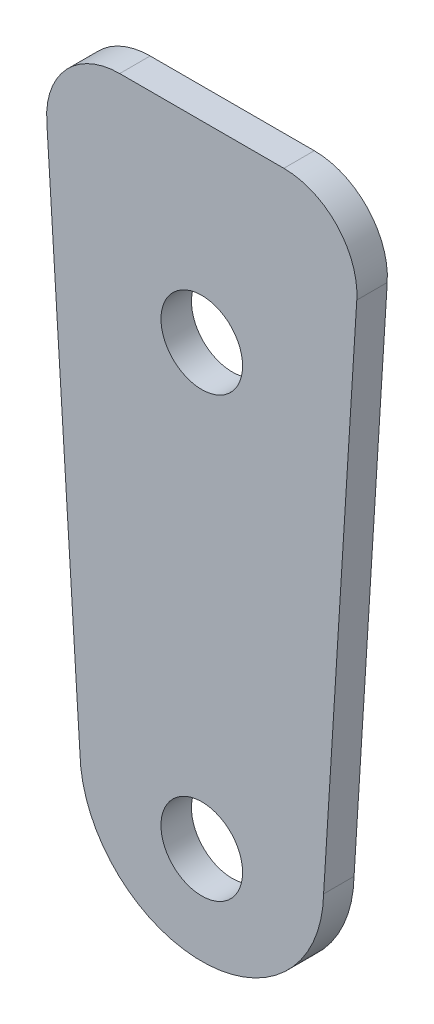
ISO-10303-21;
HEADER;
FILE_DESCRIPTION(('STEP AP214'),'2;1');
FILE_NAME('part.step','',(''),(''),'','','');
FILE_SCHEMA(('AUTOMOTIVE_DESIGN { 1 0 10303 214 1 1 1 1 }'));
ENDSEC;
DATA;
#1=APPLICATION_CONTEXT('core data for automotive mechanical design processes');
#2=APPLICATION_PROTOCOL_DEFINITION('international standard','automotive_design',2000,#1);
#3=PRODUCT_CONTEXT('',#1,'mechanical');
#4=PRODUCT('Part','Part','',(#3));
#5=PRODUCT_RELATED_PRODUCT_CATEGORY('part','',(#4));
#6=PRODUCT_DEFINITION_FORMATION('','',#4);
#7=PRODUCT_DEFINITION_CONTEXT('part definition',#1,'design');
#8=PRODUCT_DEFINITION('design','',#6,#7);
#9=PRODUCT_DEFINITION_SHAPE('','',#8);
#10=(LENGTH_UNIT() NAMED_UNIT(*) SI_UNIT(.MILLI.,.METRE.));
#11=(NAMED_UNIT(*) PLANE_ANGLE_UNIT() SI_UNIT($,.RADIAN.));
#12=(NAMED_UNIT(*) SI_UNIT($,.STERADIAN.) SOLID_ANGLE_UNIT());
#13=UNCERTAINTY_MEASURE_WITH_UNIT(LENGTH_MEASURE(1.E-05),#10,'distance_accuracy_value','');
#14=(GEOMETRIC_REPRESENTATION_CONTEXT(3) GLOBAL_UNCERTAINTY_ASSIGNED_CONTEXT((#13)) GLOBAL_UNIT_ASSIGNED_CONTEXT((#10,
#11,#12)) REPRESENTATION_CONTEXT('',''));
#15=CARTESIAN_POINT('',(0.,0.,0.));
#16=DIRECTION('',(0.,0.,1.));
#17=DIRECTION('',(1.,0.,0.));
#18=AXIS2_PLACEMENT_3D('',#15,#16,#17);
#19=CARTESIAN_POINT('',(0.0147414642697603,-105.114260788739,-76.2));
#20=DIRECTION('',(0.,0.,1.));
#21=DIRECTION('',(1.,0.,0.));
#22=AXIS2_PLACEMENT_3D('',#19,#20,#21);
#23=CYLINDRICAL_SURFACE('',#22,6.35136235795166);
#24=DIRECTION('',(0.,0.,1.));
#25=VECTOR('',#24,1.);
#26=CARTESIAN_POINT('',(-6.33525853573024,-105.24580470538,-76.2));
#27=LINE('',#26,#25);
#28=CARTESIAN_POINT('',(-6.33525853573024,-105.24580470538,58.6104999999999));
#29=VERTEX_POINT('',#28);
#30=CARTESIAN_POINT('',(-6.33525853573024,-105.24580470538,60.1979999999999));
#31=VERTEX_POINT('',#30);
#32=EDGE_CURVE('E118',#29,#31,#27,.T.);
#33=ORIENTED_EDGE('',*,*,#32,.F.);
#34=CARTESIAN_POINT('',(0.0147414642697603,-105.114260788739,58.6104999999999));
#35=DIRECTION('',(0.,0.,1.));
#36=DIRECTION('',(1.,0.,0.));
#37=AXIS2_PLACEMENT_3D('',#34,#35,#36);
#38=CIRCLE('',#37,6.35136235795166);
#39=CARTESIAN_POINT('',(6.36474146426976,-105.24580470538,58.6104999999999));
#40=VERTEX_POINT('',#39);
#41=EDGE_CURVE('E148',#40,#29,#38,.F.);
#42=ORIENTED_EDGE('',*,*,#41,.F.);
#43=DIRECTION('',(0.,0.,1.));
#44=VECTOR('',#43,1.);
#45=CARTESIAN_POINT('',(6.36474146426976,-105.24580470538,-76.2));
#46=LINE('',#45,#44);
#47=CARTESIAN_POINT('',(6.36474146426976,-105.24580470538,60.1979999999999));
#48=VERTEX_POINT('',#47);
#49=EDGE_CURVE('E136',#40,#48,#46,.T.);
#50=ORIENTED_EDGE('',*,*,#49,.T.);
#51=CARTESIAN_POINT('',(0.0147414642697603,-105.114260788739,60.1979999999999));
#52=DIRECTION('',(0.,0.,-1.));
#53=DIRECTION('',(-1.,0.,0.));
#54=AXIS2_PLACEMENT_3D('',#51,#52,#53);
#55=CIRCLE('',#54,6.35136235795166);
#56=EDGE_CURVE('E137',#31,#48,#55,.F.);
#57=ORIENTED_EDGE('',*,*,#56,.F.);
#58=EDGE_LOOP('',(#33,#42,#50,#57));
#59=FACE_BOUND('',#58,.T.);
#60=ADVANCED_FACE('F40',(#59),#23,.T.);
#61=CARTESIAN_POINT('',(-6.33525853573024,-105.24580470538,-76.2));
#62=DIRECTION('',(-0.998052578482889,-0.0623782861551806,0.));
#63=DIRECTION('',(0.0623782861551806,-0.998052578482889,0.));
#64=AXIS2_PLACEMENT_3D('',#61,#62,#63);
#65=PLANE('',#64);
#66=DIRECTION('',(-0.0623782861551806,0.998052578482889,0.));
#67=VECTOR('',#66,1.);
#68=CARTESIAN_POINT('',(-6.33525853573024,-105.24580470538,58.6104999999999));
#69=LINE('',#68,#67);
#70=CARTESIAN_POINT('',(-8.06485468746499,-77.5722662776241,58.6104999999999));
#71=VERTEX_POINT('',#70);
#72=EDGE_CURVE('E55',#29,#71,#69,.T.);
#73=ORIENTED_EDGE('',*,*,#72,.F.);
#74=ORIENTED_EDGE('',*,*,#32,.T.);
#75=DIRECTION('',(0.0623782861551806,-0.998052578482889,0.));
#76=VECTOR('',#75,1.);
#77=CARTESIAN_POINT('',(-6.33525853573024,-105.24580470538,60.1979999999999));
#78=LINE('',#77,#76);
#79=CARTESIAN_POINT('',(-8.06485468746499,-77.5722662776241,60.1979999999999));
#80=VERTEX_POINT('',#79);
#81=EDGE_CURVE('E132',#80,#31,#78,.T.);
#82=ORIENTED_EDGE('',*,*,#81,.F.);
#83=DIRECTION('',(0.,0.,1.));
#84=VECTOR('',#83,1.);
#85=CARTESIAN_POINT('',(-8.06485468746499,-77.5722662776241,47.4979999999999));
#86=LINE('',#85,#84);
#87=EDGE_CURVE('E49',#80,#71,#86,.F.);
#88=ORIENTED_EDGE('',*,*,#87,.T.);
#89=EDGE_LOOP('',(#73,#74,#82,#88));
#90=FACE_BOUND('',#89,.T.);
#91=ADVANCED_FACE('F130',(#90),#65,.T.);
#92=CARTESIAN_POINT('',(6.36474146426976,-105.24580470538,-76.2));
#93=DIRECTION('',(0.998052578482889,-0.0623782861551805,0.));
#94=DIRECTION('',(0.0623782861551805,0.998052578482889,0.));
#95=AXIS2_PLACEMENT_3D('',#92,#93,#94);
#96=PLANE('',#95);
#97=DIRECTION('',(-0.0623782861551805,-0.998052578482889,0.));
#98=VECTOR('',#97,1.);
#99=CARTESIAN_POINT('',(6.36474146426976,-105.24580470538,58.6104999999999));
#100=LINE('',#99,#98);
#101=CARTESIAN_POINT('',(8.0943376160045,-77.5722662776241,58.6104999999999));
#102=VERTEX_POINT('',#101);
#103=EDGE_CURVE('E149',#102,#40,#100,.T.);
#104=ORIENTED_EDGE('',*,*,#103,.F.);
#105=DIRECTION('',(0.,0.,-1.));
#106=VECTOR('',#105,1.);
#107=CARTESIAN_POINT('',(8.0943376160045,-77.5722662776241,60.1979999999999));
#108=LINE('',#107,#106);
#109=CARTESIAN_POINT('',(8.0943376160045,-77.5722662776241,60.1979999999999));
#110=VERTEX_POINT('',#109);
#111=EDGE_CURVE('E115',#102,#110,#108,.F.);
#112=ORIENTED_EDGE('',*,*,#111,.T.);
#113=DIRECTION('',(0.0623782861551805,0.998052578482889,0.));
#114=VECTOR('',#113,1.);
#115=CARTESIAN_POINT('',(6.36474146426976,-105.24580470538,60.1979999999999));
#116=LINE('',#115,#114);
#117=EDGE_CURVE('E111',#48,#110,#116,.T.);
#118=ORIENTED_EDGE('',*,*,#117,.F.);
#119=ORIENTED_EDGE('',*,*,#49,.F.);
#120=EDGE_LOOP('',(#104,#112,#118,#119));
#121=FACE_BOUND('',#120,.T.);
#122=ADVANCED_FACE('F198',(#121),#96,.T.);
#123=CARTESIAN_POINT('',(-12.6852585357302,-73.5246050073729,47.4979999999999));
#124=DIRECTION('',(0.,-1.,0.));
#125=DIRECTION('',(0.,0.,-1.));
#126=AXIS2_PLACEMENT_3D('',#123,#124,#125);
#127=PLANE('',#126);
#128=DIRECTION('',(0.,0.,-1.));
#129=VECTOR('',#128,1.);
#130=CARTESIAN_POINT('',(4.2917572919847,-73.5246050073729,47.4979999999999));
#131=LINE('',#130,#129);
#132=CARTESIAN_POINT('',(4.2917572919847,-73.5246050073729,60.1979999999999));
#133=VERTEX_POINT('',#132);
#134=CARTESIAN_POINT('',(4.29175729198469,-73.5246050073729,58.6104999999999));
#135=VERTEX_POINT('',#134);
#136=EDGE_CURVE('E106',#133,#135,#131,.T.);
#137=ORIENTED_EDGE('',*,*,#136,.T.);
#138=DIRECTION('',(-1.,0.,0.));
#139=VECTOR('',#138,1.);
#140=CARTESIAN_POINT('',(-12.6852585357302,-73.5246050073729,58.6104999999999));
#141=LINE('',#140,#139);
#142=CARTESIAN_POINT('',(-4.26227436344518,-73.5246050073729,58.6104999999999));
#143=VERTEX_POINT('',#142);
#144=EDGE_CURVE('E94',#135,#143,#141,.T.);
#145=ORIENTED_EDGE('',*,*,#144,.T.);
#146=DIRECTION('',(0.,0.,1.));
#147=VECTOR('',#146,1.);
#148=CARTESIAN_POINT('',(-4.26227436344518,-73.5246050073729,60.1979999999999));
#149=LINE('',#148,#147);
#150=CARTESIAN_POINT('',(-4.26227436344518,-73.5246050073729,60.1979999999999));
#151=VERTEX_POINT('',#150);
#152=EDGE_CURVE('E104',#143,#151,#149,.T.);
#153=ORIENTED_EDGE('',*,*,#152,.T.);
#154=DIRECTION('',(1.,0.,0.));
#155=VECTOR('',#154,1.);
#156=CARTESIAN_POINT('',(-12.6852585357302,-73.5246050073729,60.1979999999999));
#157=LINE('',#156,#155);
#158=EDGE_CURVE('E141',#151,#133,#157,.T.);
#159=ORIENTED_EDGE('',*,*,#158,.T.);
#160=EDGE_LOOP('',(#137,#145,#153,#159));
#161=FACE_BOUND('',#160,.T.);
#162=ADVANCED_FACE('F102',(#161),#127,.F.);
#163=CARTESIAN_POINT('',(-12.6852585357302,-73.5246050073729,60.1979999999999));
#164=DIRECTION('',(0.,0.,-1.));
#165=DIRECTION('',(-1.,0.,0.));
#166=AXIS2_PLACEMENT_3D('',#163,#164,#165);
#167=PLANE('',#166);
#168=CARTESIAN_POINT('',(0.0147414642697566,-106.385623146691,60.1979999999999));
#169=DIRECTION('',(0.,0.,1.));
#170=DIRECTION('',(1.,0.,0.));
#171=AXIS2_PLACEMENT_3D('',#168,#169,#170);
#172=CIRCLE('',#171,2.127);
#173=CARTESIAN_POINT('',(2.14174146426976,-106.385623146691,60.1979999999999));
#174=VERTEX_POINT('',#173);
#175=EDGE_CURVE('E167',#174,#174,#172,.T.);
#176=ORIENTED_EDGE('',*,*,#175,.F.);
#177=EDGE_LOOP('',(#176));
#178=FACE_BOUND('',#177,.T.);
#179=CARTESIAN_POINT('',(0.0147414642697538,-83.5256231466905,60.1979999999999));
#180=DIRECTION('',(0.,0.,1.));
#181=DIRECTION('',(1.,0.,0.));
#182=AXIS2_PLACEMENT_3D('',#179,#180,#181);
#183=CIRCLE('',#182,2.127);
#184=CARTESIAN_POINT('',(2.14174146426975,-83.5256231466905,60.1979999999999));
#185=VERTEX_POINT('',#184);
#186=EDGE_CURVE('E159',#185,#185,#183,.T.);
#187=ORIENTED_EDGE('',*,*,#186,.F.);
#188=EDGE_LOOP('',(#187));
#189=FACE_BOUND('',#188,.T.);
#190=ORIENTED_EDGE('',*,*,#117,.T.);
#191=CARTESIAN_POINT('',(4.2917572919847,-77.3346050073729,60.1979999999999));
#192=DIRECTION('',(0.,0.,-1.));
#193=DIRECTION('',(-1.,0.,0.));
#194=AXIS2_PLACEMENT_3D('',#191,#192,#193);
#195=CIRCLE('',#194,3.81);
#196=EDGE_CURVE('E126',#110,#133,#195,.F.);
#197=ORIENTED_EDGE('',*,*,#196,.T.);
#198=ORIENTED_EDGE('',*,*,#158,.F.);
#199=CARTESIAN_POINT('',(-4.26227436344518,-77.3346050073729,60.1979999999999));
#200=DIRECTION('',(0.,0.,-1.));
#201=DIRECTION('',(-1.,0.,0.));
#202=AXIS2_PLACEMENT_3D('',#199,#200,#201);
#203=CIRCLE('',#202,3.81);
#204=EDGE_CURVE('E63',#151,#80,#203,.F.);
#205=ORIENTED_EDGE('',*,*,#204,.T.);
#206=ORIENTED_EDGE('',*,*,#81,.T.);
#207=ORIENTED_EDGE('',*,*,#56,.T.);
#208=EDGE_LOOP('',(#190,#197,#198,#205,#206,#207));
#209=FACE_BOUND('',#208,.T.);
#210=ADVANCED_FACE('F184',(#178,#189,#209),#167,.F.);
#211=CARTESIAN_POINT('',(4.2917572919847,-77.3346050073729,47.4979999999999));
#212=DIRECTION('',(0.,0.,1.));
#213=DIRECTION('',(0.,-1.,0.));
#214=AXIS2_PLACEMENT_3D('',#211,#212,#213);
#215=CYLINDRICAL_SURFACE('',#214,3.81);
#216=CARTESIAN_POINT('',(4.2917572919847,-77.3346050073729,58.6104999999999));
#217=DIRECTION('',(0.,0.,1.));
#218=DIRECTION('',(1.,0.,0.));
#219=AXIS2_PLACEMENT_3D('',#216,#217,#218);
#220=CIRCLE('',#219,3.81);
#221=EDGE_CURVE('E152',#135,#102,#220,.F.);
#222=ORIENTED_EDGE('',*,*,#221,.F.);
#223=ORIENTED_EDGE('',*,*,#136,.F.);
#224=ORIENTED_EDGE('',*,*,#196,.F.);
#225=ORIENTED_EDGE('',*,*,#111,.F.);
#226=EDGE_LOOP('',(#222,#223,#224,#225));
#227=FACE_BOUND('',#226,.T.);
#228=ADVANCED_FACE('F187',(#227),#215,.T.);
#229=CARTESIAN_POINT('',(-4.26227436344518,-77.3346050073729,47.4979999999999));
#230=DIRECTION('',(0.,0.,-1.));
#231=DIRECTION('',(0.,1.,0.));
#232=AXIS2_PLACEMENT_3D('',#229,#230,#231);
#233=CYLINDRICAL_SURFACE('',#232,3.81);
#234=CARTESIAN_POINT('',(-4.26227436344518,-77.3346050073729,58.6104999999999));
#235=DIRECTION('',(0.,0.,1.));
#236=DIRECTION('',(1.,0.,0.));
#237=AXIS2_PLACEMENT_3D('',#234,#235,#236);
#238=CIRCLE('',#237,3.81);
#239=EDGE_CURVE('E11',#71,#143,#238,.F.);
#240=ORIENTED_EDGE('',*,*,#239,.F.);
#241=ORIENTED_EDGE('',*,*,#87,.F.);
#242=ORIENTED_EDGE('',*,*,#204,.F.);
#243=ORIENTED_EDGE('',*,*,#152,.F.);
#244=EDGE_LOOP('',(#240,#241,#242,#243));
#245=FACE_BOUND('',#244,.T.);
#246=ADVANCED_FACE('F42',(#245),#233,.T.);
#247=CARTESIAN_POINT('',(-32.8306227687139,-111.465623146691,58.6104999999999));
#248=DIRECTION('',(0.,0.,1.));
#249=DIRECTION('',(1.,0.,0.));
#250=AXIS2_PLACEMENT_3D('',#247,#248,#249);
#251=PLANE('',#250);
#252=CARTESIAN_POINT('',(0.0147414642697566,-106.385623146691,58.6104999999999));
#253=DIRECTION('',(0.,0.,1.));
#254=DIRECTION('',(1.,0.,0.));
#255=AXIS2_PLACEMENT_3D('',#252,#253,#254);
#256=CIRCLE('',#255,2.127);
#257=CARTESIAN_POINT('',(2.14174146426976,-106.385623146691,58.6104999999999));
#258=VERTEX_POINT('',#257);
#259=EDGE_CURVE('E108',#258,#258,#256,.T.);
#260=ORIENTED_EDGE('',*,*,#259,.T.);
#261=EDGE_LOOP('',(#260));
#262=FACE_BOUND('',#261,.T.);
#263=CARTESIAN_POINT('',(0.0147414642697538,-83.5256231466905,58.6104999999999));
#264=DIRECTION('',(0.,0.,1.));
#265=DIRECTION('',(1.,0.,0.));
#266=AXIS2_PLACEMENT_3D('',#263,#264,#265);
#267=CIRCLE('',#266,2.127);
#268=CARTESIAN_POINT('',(2.14174146426975,-83.5256231466905,58.6104999999999));
#269=VERTEX_POINT('',#268);
#270=EDGE_CURVE('E163',#269,#269,#267,.T.);
#271=ORIENTED_EDGE('',*,*,#270,.T.);
#272=EDGE_LOOP('',(#271));
#273=FACE_BOUND('',#272,.T.);
#274=ORIENTED_EDGE('',*,*,#41,.T.);
#275=ORIENTED_EDGE('',*,*,#72,.T.);
#276=ORIENTED_EDGE('',*,*,#239,.T.);
#277=ORIENTED_EDGE('',*,*,#144,.F.);
#278=ORIENTED_EDGE('',*,*,#221,.T.);
#279=ORIENTED_EDGE('',*,*,#103,.T.);
#280=EDGE_LOOP('',(#274,#275,#276,#277,#278,#279));
#281=FACE_BOUND('',#280,.T.);
#282=ADVANCED_FACE('F93',(#262,#273,#281),#251,.F.);
#283=CARTESIAN_POINT('',(0.0147414642697538,-83.5256231466905,58.6104999999999));
#284=DIRECTION('',(0.,0.,1.));
#285=DIRECTION('',(1.,0.,0.));
#286=AXIS2_PLACEMENT_3D('',#283,#284,#285);
#287=CYLINDRICAL_SURFACE('',#286,2.127);
#288=CARTESIAN_POINT('',(2.14174146426975,-83.5256231466905,58.6104999999999));
#289=CARTESIAN_POINT('',(2.14174146426975,-83.5256231466905,58.6270364583332));
#290=CARTESIAN_POINT('',(2.14174146426975,-83.5256231466905,58.6435729166665));
#291=CARTESIAN_POINT('',(2.14174146426975,-83.5256231466905,58.6766458333332));
#292=CARTESIAN_POINT('',(2.14174146426975,-83.5256231466905,58.6931822916665));
#293=CARTESIAN_POINT('',(2.14174146426975,-83.5256231466905,58.7262552083332));
#294=CARTESIAN_POINT('',(2.14174146426975,-83.5256231466905,58.7427916666665));
#295=CARTESIAN_POINT('',(2.14174146426975,-83.5256231466905,58.7758645833332));
#296=CARTESIAN_POINT('',(2.14174146426975,-83.5256231466905,58.7924010416665));
#297=CARTESIAN_POINT('',(2.14174146426975,-83.5256231466905,58.8254739583332));
#298=CARTESIAN_POINT('',(2.14174146426975,-83.5256231466905,58.8420104166665));
#299=CARTESIAN_POINT('',(2.14174146426975,-83.5256231466905,58.8750833333332));
#300=CARTESIAN_POINT('',(2.14174146426975,-83.5256231466905,58.8916197916665));
#301=CARTESIAN_POINT('',(2.14174146426975,-83.5256231466905,58.9246927083332));
#302=CARTESIAN_POINT('',(2.14174146426975,-83.5256231466905,58.9412291666665));
#303=CARTESIAN_POINT('',(2.14174146426975,-83.5256231466905,58.9743020833332));
#304=CARTESIAN_POINT('',(2.14174146426975,-83.5256231466905,58.9908385416665));
#305=CARTESIAN_POINT('',(2.14174146426975,-83.5256231466905,59.0239114583332));
#306=CARTESIAN_POINT('',(2.14174146426975,-83.5256231466905,59.0404479166666));
#307=CARTESIAN_POINT('',(2.14174146426975,-83.5256231466905,59.0735208333332));
#308=CARTESIAN_POINT('',(2.14174146426975,-83.5256231466905,59.0900572916665));
#309=CARTESIAN_POINT('',(2.14174146426975,-83.5256231466905,59.1231302083332));
#310=CARTESIAN_POINT('',(2.14174146426975,-83.5256231466905,59.1396666666665));
#311=CARTESIAN_POINT('',(2.14174146426975,-83.5256231466905,59.1727395833332));
#312=CARTESIAN_POINT('',(2.14174146426975,-83.5256231466905,59.1892760416666));
#313=CARTESIAN_POINT('',(2.14174146426975,-83.5256231466905,59.2223489583332));
#314=CARTESIAN_POINT('',(2.14174146426975,-83.5256231466905,59.2388854166665));
#315=CARTESIAN_POINT('',(2.14174146426975,-83.5256231466905,59.2719583333332));
#316=CARTESIAN_POINT('',(2.14174146426975,-83.5256231466905,59.2884947916666));
#317=CARTESIAN_POINT('',(2.14174146426975,-83.5256231466905,59.3215677083332));
#318=CARTESIAN_POINT('',(2.14174146426975,-83.5256231466905,59.3381041666666));
#319=CARTESIAN_POINT('',(2.14174146426975,-83.5256231466905,59.3711770833332));
#320=CARTESIAN_POINT('',(2.14174146426975,-83.5256231466905,59.3877135416665));
#321=CARTESIAN_POINT('',(2.14174146426975,-83.5256231466905,59.4207864583332));
#322=CARTESIAN_POINT('',(2.14174146426975,-83.5256231466905,59.4373229166666));
#323=CARTESIAN_POINT('',(2.14174146426975,-83.5256231466905,59.4703958333332));
#324=CARTESIAN_POINT('',(2.14174146426975,-83.5256231466905,59.4869322916665));
#325=CARTESIAN_POINT('',(2.14174146426975,-83.5256231466905,59.5200052083332));
#326=CARTESIAN_POINT('',(2.14174146426975,-83.5256231466905,59.5365416666666));
#327=CARTESIAN_POINT('',(2.14174146426975,-83.5256231466905,59.5696145833332));
#328=CARTESIAN_POINT('',(2.14174146426975,-83.5256231466905,59.5861510416665));
#329=CARTESIAN_POINT('',(2.14174146426975,-83.5256231466905,59.6192239583332));
#330=CARTESIAN_POINT('',(2.14174146426975,-83.5256231466905,59.6357604166665));
#331=CARTESIAN_POINT('',(2.14174146426975,-83.5256231466905,59.6688333333332));
#332=CARTESIAN_POINT('',(2.14174146426975,-83.5256231466905,59.6853697916666));
#333=CARTESIAN_POINT('',(2.14174146426975,-83.5256231466905,59.7184427083332));
#334=CARTESIAN_POINT('',(2.14174146426975,-83.5256231466905,59.7349791666665));
#335=CARTESIAN_POINT('',(2.14174146426975,-83.5256231466905,59.7680520833332));
#336=CARTESIAN_POINT('',(2.14174146426975,-83.5256231466905,59.7845885416666));
#337=CARTESIAN_POINT('',(2.14174146426975,-83.5256231466905,59.8176614583332));
#338=CARTESIAN_POINT('',(2.14174146426975,-83.5256231466905,59.8341979166666));
#339=CARTESIAN_POINT('',(2.14174146426975,-83.5256231466905,59.8672708333332));
#340=CARTESIAN_POINT('',(2.14174146426975,-83.5256231466905,59.8838072916665));
#341=CARTESIAN_POINT('',(2.14174146426975,-83.5256231466905,59.9168802083332));
#342=CARTESIAN_POINT('',(2.14174146426975,-83.5256231466905,59.9334166666666));
#343=CARTESIAN_POINT('',(2.14174146426975,-83.5256231466905,59.9664895833332));
#344=CARTESIAN_POINT('',(2.14174146426975,-83.5256231466905,59.9830260416666));
#345=CARTESIAN_POINT('',(2.14174146426975,-83.5256231466905,60.0160989583332));
#346=CARTESIAN_POINT('',(2.14174146426975,-83.5256231466905,60.0326354166666));
#347=CARTESIAN_POINT('',(2.14174146426975,-83.5256231466905,60.0657083333332));
#348=CARTESIAN_POINT('',(2.14174146426975,-83.5256231466905,60.0822447916666));
#349=CARTESIAN_POINT('',(2.14174146426975,-83.5256231466905,60.1153177083332));
#350=CARTESIAN_POINT('',(2.14174146426975,-83.5256231466905,60.1318541666666));
#351=CARTESIAN_POINT('',(2.14174146426975,-83.5256231466905,60.1649270833332));
#352=CARTESIAN_POINT('',(2.14174146426975,-83.5256231466905,60.1814635416666));
#353=CARTESIAN_POINT('',(2.14174146426975,-83.5256231466905,60.1979999999999));
#354=B_SPLINE_CURVE_WITH_KNOTS('',3,(#288,#289,#290,#291,#292,#293,#294,#295,#296,#297,#298,
#299,#300,#301,#302,#303,#304,#305,#306,#307,#308,#309,#310,#311,#312,#313,#314,#315,#316,#317,
#318,#319,#320,#321,#322,#323,#324,#325,#326,#327,#328,#329,#330,#331,#332,#333,#334,#335,#336,
#337,#338,#339,#340,#341,#342,#343,#344,#345,#346,#347,#348,#349,#350,#351,#352,#353),
.UNSPECIFIED.,.F.,.F.,(4,2,2,2,2,2,2,2,2,2,2,2,2,2,2,2,2,2,2,2,2,2,2,2,2,2,2,2,2,2,2,2,4),(0.,
0.0496093750000023,0.0992187500000047,0.148828125000007,0.198437500000002,0.248046875000005,
0.297656250000007,0.347265625000003,0.396875000000005,0.446484375000007,0.496093750000003,
0.545703125000005,0.595312500000007,0.644921875000003,0.694531250000005,0.744140625000007,
0.793750000000003,0.843359375000005,0.892968750000007,0.94257812500001,0.992187500000005,
1.04179687500001,1.09140625000001,1.14101562500001,1.19062500000001,1.24023437500001,
1.28984375000001,1.33945312500001,1.38906250000001,1.43867187500001,1.48828125000001,
1.53789062500001,1.58750000000001),.UNSPECIFIED.);
#355=EDGE_CURVE('BSEAM180',#269,#185,#354,.T.);
#356=ORIENTED_EDGE('',*,*,#270,.F.);
#357=ORIENTED_EDGE('',*,*,#186,.T.);
#358=ORIENTED_EDGE('',*,*,#355,.T.);
#359=ORIENTED_EDGE('',*,*,#355,.F.);
#360=EDGE_LOOP('',(#356,#358,#357,#359));
#361=FACE_BOUND('',#360,.T.);
#362=ADVANCED_FACE('F180',(#361),#287,.F.);
#363=CARTESIAN_POINT('',(0.0147414642697566,-106.385623146691,58.6104999999999));
#364=DIRECTION('',(0.,0.,1.));
#365=DIRECTION('',(1.,0.,0.));
#366=AXIS2_PLACEMENT_3D('',#363,#364,#365);
#367=CYLINDRICAL_SURFACE('',#366,2.127);
#368=CARTESIAN_POINT('',(2.14174146426976,-106.385623146691,58.6104999999999));
#369=CARTESIAN_POINT('',(2.14174146426976,-106.385623146691,58.6270364583332));
#370=CARTESIAN_POINT('',(2.14174146426976,-106.385623146691,58.6435729166665));
#371=CARTESIAN_POINT('',(2.14174146426976,-106.385623146691,58.6766458333332));
#372=CARTESIAN_POINT('',(2.14174146426976,-106.385623146691,58.6931822916665));
#373=CARTESIAN_POINT('',(2.14174146426976,-106.385623146691,58.7262552083332));
#374=CARTESIAN_POINT('',(2.14174146426976,-106.385623146691,58.7427916666665));
#375=CARTESIAN_POINT('',(2.14174146426976,-106.385623146691,58.7758645833332));
#376=CARTESIAN_POINT('',(2.14174146426976,-106.385623146691,58.7924010416665));
#377=CARTESIAN_POINT('',(2.14174146426976,-106.385623146691,58.8254739583332));
#378=CARTESIAN_POINT('',(2.14174146426976,-106.385623146691,58.8420104166665));
#379=CARTESIAN_POINT('',(2.14174146426976,-106.385623146691,58.8750833333332));
#380=CARTESIAN_POINT('',(2.14174146426976,-106.385623146691,58.8916197916665));
#381=CARTESIAN_POINT('',(2.14174146426976,-106.385623146691,58.9246927083332));
#382=CARTESIAN_POINT('',(2.14174146426976,-106.385623146691,58.9412291666665));
#383=CARTESIAN_POINT('',(2.14174146426976,-106.385623146691,58.9743020833332));
#384=CARTESIAN_POINT('',(2.14174146426976,-106.385623146691,58.9908385416665));
#385=CARTESIAN_POINT('',(2.14174146426976,-106.385623146691,59.0239114583332));
#386=CARTESIAN_POINT('',(2.14174146426976,-106.385623146691,59.0404479166666));
#387=CARTESIAN_POINT('',(2.14174146426976,-106.385623146691,59.0735208333332));
#388=CARTESIAN_POINT('',(2.14174146426976,-106.385623146691,59.0900572916665));
#389=CARTESIAN_POINT('',(2.14174146426976,-106.385623146691,59.1231302083332));
#390=CARTESIAN_POINT('',(2.14174146426976,-106.385623146691,59.1396666666665));
#391=CARTESIAN_POINT('',(2.14174146426976,-106.385623146691,59.1727395833332));
#392=CARTESIAN_POINT('',(2.14174146426976,-106.385623146691,59.1892760416666));
#393=CARTESIAN_POINT('',(2.14174146426976,-106.385623146691,59.2223489583332));
#394=CARTESIAN_POINT('',(2.14174146426976,-106.385623146691,59.2388854166665));
#395=CARTESIAN_POINT('',(2.14174146426976,-106.385623146691,59.2719583333332));
#396=CARTESIAN_POINT('',(2.14174146426976,-106.385623146691,59.2884947916666));
#397=CARTESIAN_POINT('',(2.14174146426976,-106.385623146691,59.3215677083332));
#398=CARTESIAN_POINT('',(2.14174146426976,-106.385623146691,59.3381041666666));
#399=CARTESIAN_POINT('',(2.14174146426976,-106.385623146691,59.3711770833332));
#400=CARTESIAN_POINT('',(2.14174146426976,-106.385623146691,59.3877135416665));
#401=CARTESIAN_POINT('',(2.14174146426976,-106.385623146691,59.4207864583332));
#402=CARTESIAN_POINT('',(2.14174146426976,-106.385623146691,59.4373229166666));
#403=CARTESIAN_POINT('',(2.14174146426976,-106.385623146691,59.4703958333332));
#404=CARTESIAN_POINT('',(2.14174146426976,-106.385623146691,59.4869322916665));
#405=CARTESIAN_POINT('',(2.14174146426976,-106.385623146691,59.5200052083332));
#406=CARTESIAN_POINT('',(2.14174146426976,-106.385623146691,59.5365416666666));
#407=CARTESIAN_POINT('',(2.14174146426976,-106.385623146691,59.5696145833332));
#408=CARTESIAN_POINT('',(2.14174146426976,-106.385623146691,59.5861510416665));
#409=CARTESIAN_POINT('',(2.14174146426976,-106.385623146691,59.6192239583332));
#410=CARTESIAN_POINT('',(2.14174146426976,-106.385623146691,59.6357604166665));
#411=CARTESIAN_POINT('',(2.14174146426976,-106.385623146691,59.6688333333332));
#412=CARTESIAN_POINT('',(2.14174146426976,-106.385623146691,59.6853697916666));
#413=CARTESIAN_POINT('',(2.14174146426976,-106.385623146691,59.7184427083332));
#414=CARTESIAN_POINT('',(2.14174146426976,-106.385623146691,59.7349791666665));
#415=CARTESIAN_POINT('',(2.14174146426976,-106.385623146691,59.7680520833332));
#416=CARTESIAN_POINT('',(2.14174146426976,-106.385623146691,59.7845885416666));
#417=CARTESIAN_POINT('',(2.14174146426976,-106.385623146691,59.8176614583332));
#418=CARTESIAN_POINT('',(2.14174146426976,-106.385623146691,59.8341979166666));
#419=CARTESIAN_POINT('',(2.14174146426976,-106.385623146691,59.8672708333332));
#420=CARTESIAN_POINT('',(2.14174146426976,-106.385623146691,59.8838072916665));
#421=CARTESIAN_POINT('',(2.14174146426976,-106.385623146691,59.9168802083332));
#422=CARTESIAN_POINT('',(2.14174146426976,-106.385623146691,59.9334166666666));
#423=CARTESIAN_POINT('',(2.14174146426976,-106.385623146691,59.9664895833332));
#424=CARTESIAN_POINT('',(2.14174146426976,-106.385623146691,59.9830260416666));
#425=CARTESIAN_POINT('',(2.14174146426976,-106.385623146691,60.0160989583332));
#426=CARTESIAN_POINT('',(2.14174146426976,-106.385623146691,60.0326354166666));
#427=CARTESIAN_POINT('',(2.14174146426976,-106.385623146691,60.0657083333332));
#428=CARTESIAN_POINT('',(2.14174146426976,-106.385623146691,60.0822447916666));
#429=CARTESIAN_POINT('',(2.14174146426976,-106.385623146691,60.1153177083332));
#430=CARTESIAN_POINT('',(2.14174146426976,-106.385623146691,60.1318541666666));
#431=CARTESIAN_POINT('',(2.14174146426976,-106.385623146691,60.1649270833332));
#432=CARTESIAN_POINT('',(2.14174146426976,-106.385623146691,60.1814635416666));
#433=CARTESIAN_POINT('',(2.14174146426976,-106.385623146691,60.1979999999999));
#434=B_SPLINE_CURVE_WITH_KNOTS('',3,(#368,#369,#370,#371,#372,#373,#374,#375,#376,#377,#378,
#379,#380,#381,#382,#383,#384,#385,#386,#387,#388,#389,#390,#391,#392,#393,#394,#395,#396,#397,
#398,#399,#400,#401,#402,#403,#404,#405,#406,#407,#408,#409,#410,#411,#412,#413,#414,#415,#416,
#417,#418,#419,#420,#421,#422,#423,#424,#425,#426,#427,#428,#429,#430,#431,#432,#433),
.UNSPECIFIED.,.F.,.F.,(4,2,2,2,2,2,2,2,2,2,2,2,2,2,2,2,2,2,2,2,2,2,2,2,2,2,2,2,2,2,2,2,4),(0.,
0.0496093750000023,0.0992187500000047,0.148828125000007,0.198437500000002,0.248046875000005,
0.297656250000007,0.347265625000003,0.396875000000005,0.446484375000007,0.496093750000003,
0.545703125000005,0.595312500000007,0.644921875000003,0.694531250000005,0.744140625000007,
0.793750000000003,0.843359375000005,0.892968750000007,0.94257812500001,0.992187500000005,
1.04179687500001,1.09140625000001,1.14101562500001,1.19062500000001,1.24023437500001,
1.28984375000001,1.33945312500001,1.38906250000001,1.43867187500001,1.48828125000001,
1.53789062500001,1.58750000000001),.UNSPECIFIED.);
#435=EDGE_CURVE('BSEAM177',#258,#174,#434,.T.);
#436=ORIENTED_EDGE('',*,*,#259,.F.);
#437=ORIENTED_EDGE('',*,*,#175,.T.);
#438=ORIENTED_EDGE('',*,*,#435,.T.);
#439=ORIENTED_EDGE('',*,*,#435,.F.);
#440=EDGE_LOOP('',(#436,#438,#437,#439));
#441=FACE_BOUND('',#440,.T.);
#442=ADVANCED_FACE('F177',(#441),#367,.F.);
#443=CLOSED_SHELL('',(#60,#91,#122,#162,#210,#228,#246,#282,#362,#442));
#444=MANIFOLD_SOLID_BREP('B2',#443);
#445=ADVANCED_BREP_SHAPE_REPRESENTATION('',(#18,#444),#14);
#446=SHAPE_DEFINITION_REPRESENTATION(#9,#445);
ENDSEC;
END-ISO-10303-21;
